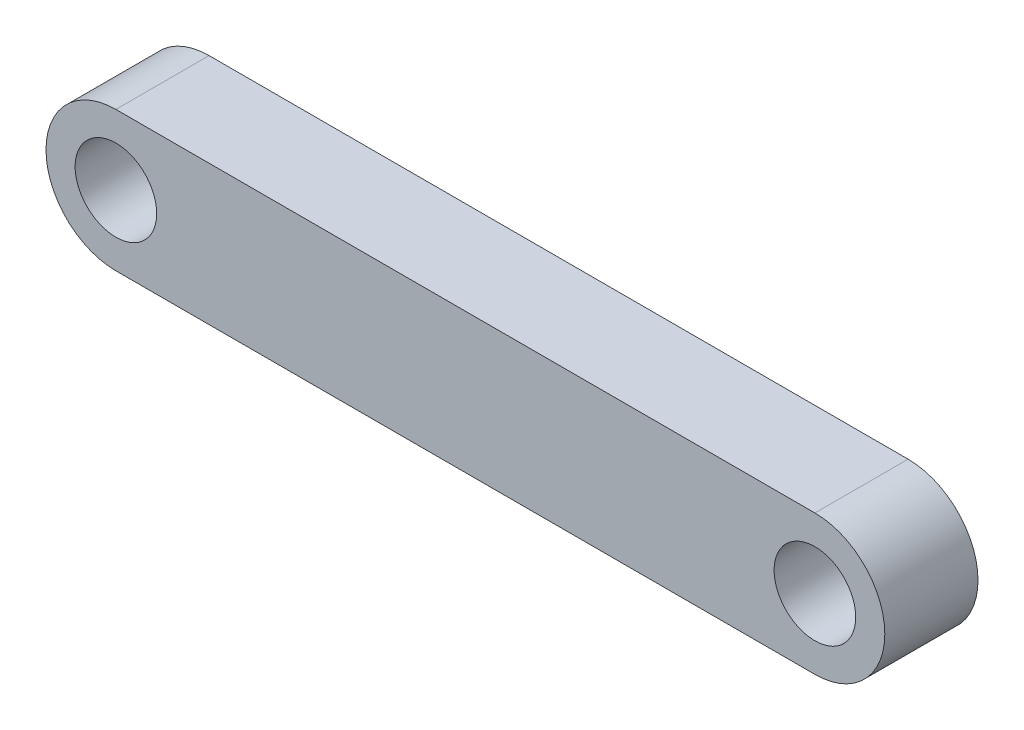
ISO-10303-21;
HEADER;
FILE_DESCRIPTION(('STEP AP214'),'2;1');
FILE_NAME('part.step','',(''),(''),'','','');
FILE_SCHEMA(('AUTOMOTIVE_DESIGN { 1 0 10303 214 1 1 1 1 }'));
ENDSEC;
DATA;
#1=APPLICATION_CONTEXT('core data for automotive mechanical design processes');
#2=APPLICATION_PROTOCOL_DEFINITION('international standard','automotive_design',2000,#1);
#3=PRODUCT_CONTEXT('',#1,'mechanical');
#4=PRODUCT('Part','Part','',(#3));
#5=PRODUCT_RELATED_PRODUCT_CATEGORY('part','',(#4));
#6=PRODUCT_DEFINITION_FORMATION('','',#4);
#7=PRODUCT_DEFINITION_CONTEXT('part definition',#1,'design');
#8=PRODUCT_DEFINITION('design','',#6,#7);
#9=PRODUCT_DEFINITION_SHAPE('','',#8);
#10=(LENGTH_UNIT() NAMED_UNIT(*) SI_UNIT(.MILLI.,.METRE.));
#11=(NAMED_UNIT(*) PLANE_ANGLE_UNIT() SI_UNIT($,.RADIAN.));
#12=(NAMED_UNIT(*) SI_UNIT($,.STERADIAN.) SOLID_ANGLE_UNIT());
#13=UNCERTAINTY_MEASURE_WITH_UNIT(LENGTH_MEASURE(1.E-05),#10,'distance_accuracy_value','');
#14=(GEOMETRIC_REPRESENTATION_CONTEXT(3) GLOBAL_UNCERTAINTY_ASSIGNED_CONTEXT((#13)) GLOBAL_UNIT_ASSIGNED_CONTEXT((#10,
#11,#12)) REPRESENTATION_CONTEXT('',''));
#15=CARTESIAN_POINT('',(0.,0.,0.));
#16=DIRECTION('',(0.,0.,1.));
#17=DIRECTION('',(1.,0.,0.));
#18=AXIS2_PLACEMENT_3D('',#15,#16,#17);
#19=CARTESIAN_POINT('',(0.,0.,4.));
#20=DIRECTION('',(0.,0.,-1.));
#21=DIRECTION('',(-1.,0.,0.));
#22=AXIS2_PLACEMENT_3D('',#19,#20,#21);
#23=PLANE('',#22);
#24=CARTESIAN_POINT('',(0.,0.,4.));
#25=DIRECTION('',(0.,0.,1.));
#26=DIRECTION('',(-1.,0.,0.));
#27=AXIS2_PLACEMENT_3D('',#24,#25,#26);
#28=CIRCLE('',#27,3.);
#29=CARTESIAN_POINT('',(0.,3.,4.));
#30=VERTEX_POINT('',#29);
#31=CARTESIAN_POINT('',(0.,-3.,4.));
#32=VERTEX_POINT('',#31);
#33=EDGE_CURVE('E87',#30,#32,#28,.T.);
#34=ORIENTED_EDGE('',*,*,#33,.T.);
#35=DIRECTION('',(1.,0.,0.));
#36=VECTOR('',#35,1.);
#37=CARTESIAN_POINT('',(0.,-3.,4.));
#38=LINE('',#37,#36);
#39=CARTESIAN_POINT('',(30.,-3.,4.));
#40=VERTEX_POINT('',#39);
#41=EDGE_CURVE('E82',#32,#40,#38,.T.);
#42=ORIENTED_EDGE('',*,*,#41,.T.);
#43=CARTESIAN_POINT('',(30.,0.,4.));
#44=DIRECTION('',(0.,0.,1.));
#45=DIRECTION('',(1.,0.,0.));
#46=AXIS2_PLACEMENT_3D('',#43,#44,#45);
#47=CIRCLE('',#46,3.);
#48=CARTESIAN_POINT('',(30.,3.,4.));
#49=VERTEX_POINT('',#48);
#50=EDGE_CURVE('E85',#40,#49,#47,.T.);
#51=ORIENTED_EDGE('',*,*,#50,.T.);
#52=DIRECTION('',(-1.,0.,0.));
#53=VECTOR('',#52,1.);
#54=CARTESIAN_POINT('',(0.,3.,4.));
#55=LINE('',#54,#53);
#56=EDGE_CURVE('E52',#49,#30,#55,.T.);
#57=ORIENTED_EDGE('',*,*,#56,.T.);
#58=EDGE_LOOP('',(#34,#42,#51,#57));
#59=FACE_BOUND('',#58,.T.);
#60=CARTESIAN_POINT('',(0.,0.,4.));
#61=DIRECTION('',(0.,0.,1.));
#62=DIRECTION('',(1.,0.,0.));
#63=AXIS2_PLACEMENT_3D('',#60,#61,#62);
#64=CIRCLE('',#63,1.75);
#65=CARTESIAN_POINT('',(1.75,0.,4.));
#66=VERTEX_POINT('',#65);
#67=EDGE_CURVE('E102',#66,#66,#64,.T.);
#68=ORIENTED_EDGE('',*,*,#67,.F.);
#69=EDGE_LOOP('',(#68));
#70=FACE_BOUND('',#69,.T.);
#71=CARTESIAN_POINT('',(30.,0.,4.));
#72=DIRECTION('',(0.,0.,1.));
#73=DIRECTION('',(1.,0.,0.));
#74=AXIS2_PLACEMENT_3D('',#71,#72,#73);
#75=CIRCLE('',#74,1.75);
#76=CARTESIAN_POINT('',(31.75,0.,4.));
#77=VERTEX_POINT('',#76);
#78=EDGE_CURVE('E117',#77,#77,#75,.T.);
#79=ORIENTED_EDGE('',*,*,#78,.F.);
#80=EDGE_LOOP('',(#79));
#81=FACE_BOUND('',#80,.T.);
#82=ADVANCED_FACE('F35',(#59,#70,#81),#23,.F.);
#83=CARTESIAN_POINT('',(0.,0.,0.));
#84=DIRECTION('',(0.,0.,-1.));
#85=DIRECTION('',(-1.,0.,0.));
#86=AXIS2_PLACEMENT_3D('',#83,#84,#85);
#87=PLANE('',#86);
#88=CARTESIAN_POINT('',(0.,0.,0.));
#89=DIRECTION('',(0.,0.,1.));
#90=DIRECTION('',(1.,0.,0.));
#91=AXIS2_PLACEMENT_3D('',#88,#89,#90);
#92=CIRCLE('',#91,1.75);
#93=CARTESIAN_POINT('',(1.75,0.,0.));
#94=VERTEX_POINT('',#93);
#95=EDGE_CURVE('E114',#94,#94,#92,.T.);
#96=ORIENTED_EDGE('',*,*,#95,.T.);
#97=EDGE_LOOP('',(#96));
#98=FACE_BOUND('',#97,.T.);
#99=CARTESIAN_POINT('',(0.,0.,0.));
#100=DIRECTION('',(0.,0.,1.));
#101=DIRECTION('',(-1.,0.,0.));
#102=AXIS2_PLACEMENT_3D('',#99,#100,#101);
#103=CIRCLE('',#102,3.);
#104=CARTESIAN_POINT('',(0.,3.,0.));
#105=VERTEX_POINT('',#104);
#106=CARTESIAN_POINT('',(0.,-3.,0.));
#107=VERTEX_POINT('',#106);
#108=EDGE_CURVE('E99',#105,#107,#103,.T.);
#109=ORIENTED_EDGE('',*,*,#108,.F.);
#110=DIRECTION('',(-1.,0.,0.));
#111=VECTOR('',#110,1.);
#112=CARTESIAN_POINT('',(0.,3.,0.));
#113=LINE('',#112,#111);
#114=CARTESIAN_POINT('',(30.,3.,0.));
#115=VERTEX_POINT('',#114);
#116=EDGE_CURVE('E75',#115,#105,#113,.T.);
#117=ORIENTED_EDGE('',*,*,#116,.F.);
#118=CARTESIAN_POINT('',(30.,0.,0.));
#119=DIRECTION('',(0.,0.,1.));
#120=DIRECTION('',(1.,0.,0.));
#121=AXIS2_PLACEMENT_3D('',#118,#119,#120);
#122=CIRCLE('',#121,3.);
#123=CARTESIAN_POINT('',(30.,-3.,0.));
#124=VERTEX_POINT('',#123);
#125=EDGE_CURVE('E69',#124,#115,#122,.T.);
#126=ORIENTED_EDGE('',*,*,#125,.F.);
#127=DIRECTION('',(1.,0.,0.));
#128=VECTOR('',#127,1.);
#129=CARTESIAN_POINT('',(0.,-3.,0.));
#130=LINE('',#129,#128);
#131=EDGE_CURVE('E91',#107,#124,#130,.T.);
#132=ORIENTED_EDGE('',*,*,#131,.F.);
#133=EDGE_LOOP('',(#109,#117,#126,#132));
#134=FACE_BOUND('',#133,.T.);
#135=CARTESIAN_POINT('',(30.,0.,0.));
#136=DIRECTION('',(0.,0.,1.));
#137=DIRECTION('',(1.,0.,0.));
#138=AXIS2_PLACEMENT_3D('',#135,#136,#137);
#139=CIRCLE('',#138,1.75);
#140=CARTESIAN_POINT('',(31.75,0.,0.));
#141=VERTEX_POINT('',#140);
#142=EDGE_CURVE('E120',#141,#141,#139,.T.);
#143=ORIENTED_EDGE('',*,*,#142,.T.);
#144=EDGE_LOOP('',(#143));
#145=FACE_BOUND('',#144,.T.);
#146=ADVANCED_FACE('F110',(#98,#134,#145),#87,.T.);
#147=CARTESIAN_POINT('',(0.,0.,4.));
#148=DIRECTION('',(0.,0.,-1.));
#149=DIRECTION('',(-1.,0.,0.));
#150=AXIS2_PLACEMENT_3D('',#147,#148,#149);
#151=CYLINDRICAL_SURFACE('',#150,3.);
#152=ORIENTED_EDGE('',*,*,#108,.T.);
#153=DIRECTION('',(0.,0.,-1.));
#154=VECTOR('',#153,1.);
#155=CARTESIAN_POINT('',(0.,-3.,4.));
#156=LINE('',#155,#154);
#157=EDGE_CURVE('E11',#32,#107,#156,.T.);
#158=ORIENTED_EDGE('',*,*,#157,.F.);
#159=ORIENTED_EDGE('',*,*,#33,.F.);
#160=DIRECTION('',(0.,0.,-1.));
#161=VECTOR('',#160,1.);
#162=CARTESIAN_POINT('',(0.,3.,4.));
#163=LINE('',#162,#161);
#164=EDGE_CURVE('E95',#30,#105,#163,.T.);
#165=ORIENTED_EDGE('',*,*,#164,.T.);
#166=EDGE_LOOP('',(#152,#158,#159,#165));
#167=FACE_BOUND('',#166,.T.);
#168=ADVANCED_FACE('F37',(#167),#151,.T.);
#169=CARTESIAN_POINT('',(0.,-3.,4.));
#170=DIRECTION('',(0.,1.,0.));
#171=DIRECTION('',(0.,0.,1.));
#172=AXIS2_PLACEMENT_3D('',#169,#170,#171);
#173=PLANE('',#172);
#174=ORIENTED_EDGE('',*,*,#131,.T.);
#175=DIRECTION('',(0.,0.,-1.));
#176=VECTOR('',#175,1.);
#177=CARTESIAN_POINT('',(30.,-3.,4.));
#178=LINE('',#177,#176);
#179=EDGE_CURVE('E44',#40,#124,#178,.T.);
#180=ORIENTED_EDGE('',*,*,#179,.F.);
#181=ORIENTED_EDGE('',*,*,#41,.F.);
#182=ORIENTED_EDGE('',*,*,#157,.T.);
#183=EDGE_LOOP('',(#174,#180,#181,#182));
#184=FACE_BOUND('',#183,.T.);
#185=ADVANCED_FACE('F90',(#184),#173,.F.);
#186=CARTESIAN_POINT('',(30.,0.,4.));
#187=DIRECTION('',(0.,0.,-1.));
#188=DIRECTION('',(-1.,0.,0.));
#189=AXIS2_PLACEMENT_3D('',#186,#187,#188);
#190=CYLINDRICAL_SURFACE('',#189,3.);
#191=ORIENTED_EDGE('',*,*,#125,.T.);
#192=DIRECTION('',(0.,0.,-1.));
#193=VECTOR('',#192,1.);
#194=CARTESIAN_POINT('',(30.,3.,4.));
#195=LINE('',#194,#193);
#196=EDGE_CURVE('E92',#49,#115,#195,.T.);
#197=ORIENTED_EDGE('',*,*,#196,.F.);
#198=ORIENTED_EDGE('',*,*,#50,.F.);
#199=ORIENTED_EDGE('',*,*,#179,.T.);
#200=EDGE_LOOP('',(#191,#197,#198,#199));
#201=FACE_BOUND('',#200,.T.);
#202=ADVANCED_FACE('F93',(#201),#190,.T.);
#203=CARTESIAN_POINT('',(0.,3.,4.));
#204=DIRECTION('',(0.,-1.,0.));
#205=DIRECTION('',(0.,0.,-1.));
#206=AXIS2_PLACEMENT_3D('',#203,#204,#205);
#207=PLANE('',#206);
#208=ORIENTED_EDGE('',*,*,#116,.T.);
#209=ORIENTED_EDGE('',*,*,#164,.F.);
#210=ORIENTED_EDGE('',*,*,#56,.F.);
#211=ORIENTED_EDGE('',*,*,#196,.T.);
#212=EDGE_LOOP('',(#208,#209,#210,#211));
#213=FACE_BOUND('',#212,.T.);
#214=ADVANCED_FACE('F107',(#213),#207,.F.);
#215=CARTESIAN_POINT('',(0.,0.,4.));
#216=DIRECTION('',(0.,0.,-1.));
#217=DIRECTION('',(-1.,0.,0.));
#218=AXIS2_PLACEMENT_3D('',#215,#216,#217);
#219=CYLINDRICAL_SURFACE('',#218,1.75);
#220=ORIENTED_EDGE('',*,*,#67,.T.);
#221=EDGE_LOOP('',(#220));
#222=FACE_BOUND('',#221,.T.);
#223=ORIENTED_EDGE('',*,*,#95,.F.);
#224=EDGE_LOOP('',(#223));
#225=FACE_BOUND('',#224,.T.);
#226=ADVANCED_FACE('F137',(#222,#225),#219,.F.);
#227=CARTESIAN_POINT('',(30.,0.,4.));
#228=DIRECTION('',(0.,0.,-1.));
#229=DIRECTION('',(-1.,0.,0.));
#230=AXIS2_PLACEMENT_3D('',#227,#228,#229);
#231=CYLINDRICAL_SURFACE('',#230,1.75);
#232=ORIENTED_EDGE('',*,*,#78,.T.);
#233=EDGE_LOOP('',(#232));
#234=FACE_BOUND('',#233,.T.);
#235=ORIENTED_EDGE('',*,*,#142,.F.);
#236=EDGE_LOOP('',(#235));
#237=FACE_BOUND('',#236,.T.);
#238=ADVANCED_FACE('F126',(#234,#237),#231,.F.);
#239=CLOSED_SHELL('',(#82,#146,#168,#185,#202,#214,#226,#238));
#240=MANIFOLD_SOLID_BREP('B2',#239);
#241=ADVANCED_BREP_SHAPE_REPRESENTATION('',(#18,#240),#14);
#242=SHAPE_DEFINITION_REPRESENTATION(#9,#241);
ENDSEC;
END-ISO-10303-21;
